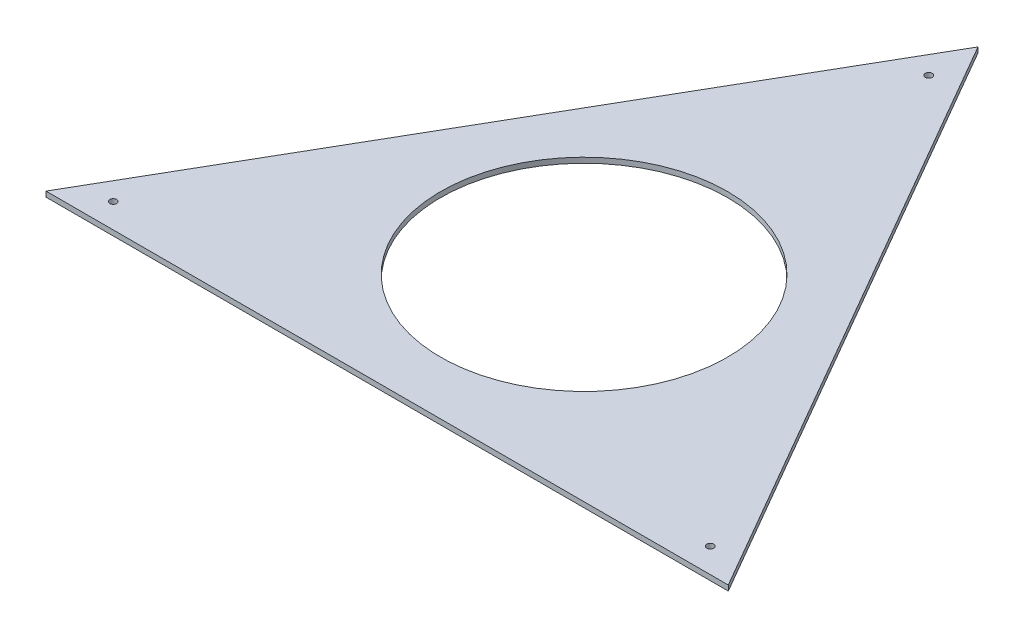
ISO-10303-21;
HEADER;
FILE_DESCRIPTION(('STEP AP214'),'2;1');
FILE_NAME('part.step','',(''),(''),'','','');
FILE_SCHEMA(('AUTOMOTIVE_DESIGN { 1 0 10303 214 1 1 1 1 }'));
ENDSEC;
DATA;
#1=APPLICATION_CONTEXT('core data for automotive mechanical design processes');
#2=APPLICATION_PROTOCOL_DEFINITION('international standard','automotive_design',2000,#1);
#3=PRODUCT_CONTEXT('',#1,'mechanical');
#4=PRODUCT('Part','Part','',(#3));
#5=PRODUCT_RELATED_PRODUCT_CATEGORY('part','',(#4));
#6=PRODUCT_DEFINITION_FORMATION('','',#4);
#7=PRODUCT_DEFINITION_CONTEXT('part definition',#1,'design');
#8=PRODUCT_DEFINITION('design','',#6,#7);
#9=PRODUCT_DEFINITION_SHAPE('','',#8);
#10=(LENGTH_UNIT() NAMED_UNIT(*) SI_UNIT(.MILLI.,.METRE.));
#11=(NAMED_UNIT(*) PLANE_ANGLE_UNIT() SI_UNIT($,.RADIAN.));
#12=(NAMED_UNIT(*) SI_UNIT($,.STERADIAN.) SOLID_ANGLE_UNIT());
#13=UNCERTAINTY_MEASURE_WITH_UNIT(LENGTH_MEASURE(1.E-05),#10,'distance_accuracy_value','');
#14=(GEOMETRIC_REPRESENTATION_CONTEXT(3) GLOBAL_UNCERTAINTY_ASSIGNED_CONTEXT((#13)) GLOBAL_UNIT_ASSIGNED_CONTEXT((#10,
#11,#12)) REPRESENTATION_CONTEXT('',''));
#15=CARTESIAN_POINT('',(0.,0.,0.));
#16=DIRECTION('',(0.,0.,1.));
#17=DIRECTION('',(1.,0.,0.));
#18=AXIS2_PLACEMENT_3D('',#15,#16,#17);
#19=CARTESIAN_POINT('',(307.958633585747,4.7625,177.8));
#20=DIRECTION('',(-0.866025403784438,0.,0.5));
#21=DIRECTION('',(0.5,0.,0.866025403784438));
#22=AXIS2_PLACEMENT_3D('',#19,#20,#21);
#23=PLANE('',#22);
#24=DIRECTION('',(-0.5,0.,-0.866025403784438));
#25=VECTOR('',#24,1.);
#26=CARTESIAN_POINT('',(307.958633585747,0.,177.8));
#27=LINE('',#26,#25);
#28=CARTESIAN_POINT('',(307.958633585747,0.,177.8));
#29=VERTEX_POINT('',#28);
#30=CARTESIAN_POINT('',(0.,0.,-355.6));
#31=VERTEX_POINT('',#30);
#32=EDGE_CURVE('E83',#29,#31,#27,.T.);
#33=ORIENTED_EDGE('',*,*,#32,.T.);
#34=DIRECTION('',(0.,-1.,0.));
#35=VECTOR('',#34,1.);
#36=CARTESIAN_POINT('',(0.,4.7625,-355.6));
#37=LINE('',#36,#35);
#38=CARTESIAN_POINT('',(0.,4.7625,-355.6));
#39=VERTEX_POINT('',#38);
#40=EDGE_CURVE('E11',#39,#31,#37,.T.);
#41=ORIENTED_EDGE('',*,*,#40,.F.);
#42=DIRECTION('',(-0.5,0.,-0.866025403784438));
#43=VECTOR('',#42,1.);
#44=CARTESIAN_POINT('',(307.958633585747,4.7625,177.8));
#45=LINE('',#44,#43);
#46=CARTESIAN_POINT('',(307.958633585747,4.7625,177.8));
#47=VERTEX_POINT('',#46);
#48=EDGE_CURVE('E76',#47,#39,#45,.T.);
#49=ORIENTED_EDGE('',*,*,#48,.F.);
#50=DIRECTION('',(0.,-1.,0.));
#51=VECTOR('',#50,1.);
#52=CARTESIAN_POINT('',(307.958633585747,4.7625,177.8));
#53=LINE('',#52,#51);
#54=EDGE_CURVE('E84',#47,#29,#53,.T.);
#55=ORIENTED_EDGE('',*,*,#54,.T.);
#56=EDGE_LOOP('',(#33,#41,#49,#55));
#57=FACE_BOUND('',#56,.T.);
#58=ADVANCED_FACE('F35',(#57),#23,.F.);
#59=CARTESIAN_POINT('',(0.,4.7625,-355.6));
#60=DIRECTION('',(0.866025403784439,0.,0.5));
#61=DIRECTION('',(0.5,0.,-0.866025403784439));
#62=AXIS2_PLACEMENT_3D('',#59,#60,#61);
#63=PLANE('',#62);
#64=DIRECTION('',(-0.5,0.,0.866025403784439));
#65=VECTOR('',#64,1.);
#66=CARTESIAN_POINT('',(0.,0.,-355.6));
#67=LINE('',#66,#65);
#68=CARTESIAN_POINT('',(-307.958633585746,0.,177.8));
#69=VERTEX_POINT('',#68);
#70=EDGE_CURVE('E64',#31,#69,#67,.T.);
#71=ORIENTED_EDGE('',*,*,#70,.T.);
#72=DIRECTION('',(0.,-1.,0.));
#73=VECTOR('',#72,1.);
#74=CARTESIAN_POINT('',(-307.958633585746,4.7625,177.8));
#75=LINE('',#74,#73);
#76=CARTESIAN_POINT('',(-307.958633585746,4.7625,177.8));
#77=VERTEX_POINT('',#76);
#78=EDGE_CURVE('E44',#77,#69,#75,.T.);
#79=ORIENTED_EDGE('',*,*,#78,.F.);
#80=DIRECTION('',(-0.5,0.,0.866025403784439));
#81=VECTOR('',#80,1.);
#82=CARTESIAN_POINT('',(0.,4.7625,-355.6));
#83=LINE('',#82,#81);
#84=EDGE_CURVE('E72',#39,#77,#83,.T.);
#85=ORIENTED_EDGE('',*,*,#84,.F.);
#86=ORIENTED_EDGE('',*,*,#40,.T.);
#87=EDGE_LOOP('',(#71,#79,#85,#86));
#88=FACE_BOUND('',#87,.T.);
#89=ADVANCED_FACE('F73',(#88),#63,.F.);
#90=CARTESIAN_POINT('',(-307.958633585746,4.7625,177.8));
#91=DIRECTION('',(0.,0.,-1.));
#92=DIRECTION('',(-1.,0.,0.));
#93=AXIS2_PLACEMENT_3D('',#90,#91,#92);
#94=PLANE('',#93);
#95=DIRECTION('',(1.,0.,0.));
#96=VECTOR('',#95,1.);
#97=CARTESIAN_POINT('',(-307.958633585746,0.,177.8));
#98=LINE('',#97,#96);
#99=EDGE_CURVE('E69',#69,#29,#98,.T.);
#100=ORIENTED_EDGE('',*,*,#99,.T.);
#101=ORIENTED_EDGE('',*,*,#54,.F.);
#102=DIRECTION('',(1.,0.,0.));
#103=VECTOR('',#102,1.);
#104=CARTESIAN_POINT('',(-307.958633585746,4.7625,177.8));
#105=LINE('',#104,#103);
#106=EDGE_CURVE('E52',#77,#47,#105,.T.);
#107=ORIENTED_EDGE('',*,*,#106,.F.);
#108=ORIENTED_EDGE('',*,*,#78,.T.);
#109=EDGE_LOOP('',(#100,#101,#107,#108));
#110=FACE_BOUND('',#109,.T.);
#111=ADVANCED_FACE('F94',(#110),#94,.F.);
#112=CARTESIAN_POINT('',(0.,4.7625,0.));
#113=DIRECTION('',(0.,1.,0.));
#114=DIRECTION('',(0.,0.,1.));
#115=AXIS2_PLACEMENT_3D('',#112,#113,#114);
#116=PLANE('',#115);
#117=CARTESIAN_POINT('',(269.463804387528,4.7625,155.575));
#118=DIRECTION('',(0.,-1.,0.));
#119=DIRECTION('',(0.,0.,1.));
#120=AXIS2_PLACEMENT_3D('',#117,#118,#119);
#121=CIRCLE('',#120,3.17499999999997);
#122=CARTESIAN_POINT('',(269.463804387528,4.7625,152.4));
#123=VERTEX_POINT('',#122);
#124=EDGE_CURVE('E188',#123,#123,#121,.T.);
#125=ORIENTED_EDGE('',*,*,#124,.T.);
#126=EDGE_LOOP('',(#125));
#127=FACE_BOUND('',#126,.T.);
#128=CARTESIAN_POINT('',(-269.463804387528,4.7625,155.575));
#129=DIRECTION('',(0.,1.,0.));
#130=DIRECTION('',(0.,0.,1.));
#131=AXIS2_PLACEMENT_3D('',#128,#129,#130);
#132=CIRCLE('',#131,3.17499999999997);
#133=CARTESIAN_POINT('',(-269.463804387528,4.7625,152.4));
#134=VERTEX_POINT('',#133);
#135=EDGE_CURVE('E198',#134,#134,#132,.T.);
#136=ORIENTED_EDGE('',*,*,#135,.F.);
#137=EDGE_LOOP('',(#136));
#138=FACE_BOUND('',#137,.T.);
#139=CARTESIAN_POINT('',(0.,4.7625,-311.15));
#140=DIRECTION('',(0.,1.,0.));
#141=DIRECTION('',(0.,0.,1.));
#142=AXIS2_PLACEMENT_3D('',#139,#140,#141);
#143=CIRCLE('',#142,3.175);
#144=CARTESIAN_POINT('',(0.,4.7625,-314.325));
#145=VERTEX_POINT('',#144);
#146=EDGE_CURVE('E183',#145,#145,#143,.T.);
#147=ORIENTED_EDGE('',*,*,#146,.F.);
#148=EDGE_LOOP('',(#147));
#149=FACE_BOUND('',#148,.T.);
#150=CARTESIAN_POINT('',(0.,4.7625,0.));
#151=DIRECTION('',(0.,1.,0.));
#152=DIRECTION('',(0.,0.,1.));
#153=AXIS2_PLACEMENT_3D('',#150,#151,#152);
#154=CIRCLE('',#153,129.54);
#155=CARTESIAN_POINT('',(0.,4.7625,-129.54));
#156=VERTEX_POINT('',#155);
#157=EDGE_CURVE('E89',#156,#156,#154,.T.);
#158=ORIENTED_EDGE('',*,*,#157,.F.);
#159=EDGE_LOOP('',(#158));
#160=FACE_BOUND('',#159,.T.);
#161=ORIENTED_EDGE('',*,*,#48,.T.);
#162=ORIENTED_EDGE('',*,*,#84,.T.);
#163=ORIENTED_EDGE('',*,*,#106,.T.);
#164=EDGE_LOOP('',(#161,#162,#163));
#165=FACE_BOUND('',#164,.T.);
#166=ADVANCED_FACE('F79',(#127,#138,#149,#160,#165),#116,.T.);
#167=CARTESIAN_POINT('',(0.,0.,0.));
#168=DIRECTION('',(0.,1.,0.));
#169=DIRECTION('',(0.,0.,1.));
#170=AXIS2_PLACEMENT_3D('',#167,#168,#169);
#171=PLANE('',#170);
#172=CARTESIAN_POINT('',(269.463804387528,0.,155.575));
#173=DIRECTION('',(0.,-1.,0.));
#174=DIRECTION('',(0.,0.,1.));
#175=AXIS2_PLACEMENT_3D('',#172,#173,#174);
#176=CIRCLE('',#175,3.17499999999997);
#177=CARTESIAN_POINT('',(269.463804387528,0.,152.4));
#178=VERTEX_POINT('',#177);
#179=EDGE_CURVE('E193',#178,#178,#176,.T.);
#180=ORIENTED_EDGE('',*,*,#179,.F.);
#181=EDGE_LOOP('',(#180));
#182=FACE_BOUND('',#181,.T.);
#183=CARTESIAN_POINT('',(-269.463804387528,0.,155.575));
#184=DIRECTION('',(0.,1.,0.));
#185=DIRECTION('',(0.,0.,1.));
#186=AXIS2_PLACEMENT_3D('',#183,#184,#185);
#187=CIRCLE('',#186,3.17499999999997);
#188=CARTESIAN_POINT('',(-269.463804387528,0.,152.4));
#189=VERTEX_POINT('',#188);
#190=EDGE_CURVE('E190',#189,#189,#187,.T.);
#191=ORIENTED_EDGE('',*,*,#190,.T.);
#192=EDGE_LOOP('',(#191));
#193=FACE_BOUND('',#192,.T.);
#194=CARTESIAN_POINT('',(0.,0.,-311.15));
#195=DIRECTION('',(0.,1.,0.));
#196=DIRECTION('',(0.,0.,1.));
#197=AXIS2_PLACEMENT_3D('',#194,#195,#196);
#198=CIRCLE('',#197,3.175);
#199=CARTESIAN_POINT('',(0.,0.,-314.325));
#200=VERTEX_POINT('',#199);
#201=EDGE_CURVE('E186',#200,#200,#198,.T.);
#202=ORIENTED_EDGE('',*,*,#201,.T.);
#203=EDGE_LOOP('',(#202));
#204=FACE_BOUND('',#203,.T.);
#205=CARTESIAN_POINT('',(0.,0.,0.));
#206=DIRECTION('',(0.,1.,0.));
#207=DIRECTION('',(0.,0.,1.));
#208=AXIS2_PLACEMENT_3D('',#205,#206,#207);
#209=CIRCLE('',#208,129.54);
#210=CARTESIAN_POINT('',(0.,0.,-129.54));
#211=VERTEX_POINT('',#210);
#212=EDGE_CURVE('E38',#211,#211,#209,.F.);
#213=ORIENTED_EDGE('',*,*,#212,.F.);
#214=EDGE_LOOP('',(#213));
#215=FACE_BOUND('',#214,.T.);
#216=ORIENTED_EDGE('',*,*,#32,.F.);
#217=ORIENTED_EDGE('',*,*,#99,.F.);
#218=ORIENTED_EDGE('',*,*,#70,.F.);
#219=EDGE_LOOP('',(#216,#217,#218));
#220=FACE_BOUND('',#219,.T.);
#221=ADVANCED_FACE('F95',(#182,#193,#204,#215,#220),#171,.F.);
#222=CARTESIAN_POINT('',(0.,4.7625,0.));
#223=DIRECTION('',(0.,-1.,0.));
#224=DIRECTION('',(0.,0.,-1.));
#225=AXIS2_PLACEMENT_3D('',#222,#223,#224);
#226=CYLINDRICAL_SURFACE('',#225,129.54);
#227=CARTESIAN_POINT('',(0.,4.7625,-129.54));
#228=CARTESIAN_POINT('',(0.,4.712890625,-129.54));
#229=CARTESIAN_POINT('',(0.,4.66328125,-129.54));
#230=CARTESIAN_POINT('',(0.,4.5640625,-129.54));
#231=CARTESIAN_POINT('',(0.,4.514453125,-129.54));
#232=CARTESIAN_POINT('',(0.,4.415234375,-129.54));
#233=CARTESIAN_POINT('',(0.,4.365625,-129.54));
#234=CARTESIAN_POINT('',(0.,4.26640625,-129.54));
#235=CARTESIAN_POINT('',(0.,4.216796875,-129.54));
#236=CARTESIAN_POINT('',(0.,4.117578125,-129.54));
#237=CARTESIAN_POINT('',(0.,4.06796875,-129.54));
#238=CARTESIAN_POINT('',(0.,3.96875,-129.54));
#239=CARTESIAN_POINT('',(0.,3.919140625,-129.54));
#240=CARTESIAN_POINT('',(0.,3.819921875,-129.54));
#241=CARTESIAN_POINT('',(0.,3.7703125,-129.54));
#242=CARTESIAN_POINT('',(0.,3.67109375,-129.54));
#243=CARTESIAN_POINT('',(0.,3.621484375,-129.54));
#244=CARTESIAN_POINT('',(0.,3.522265625,-129.54));
#245=CARTESIAN_POINT('',(0.,3.47265625,-129.54));
#246=CARTESIAN_POINT('',(0.,3.3734375,-129.54));
#247=CARTESIAN_POINT('',(0.,3.323828125,-129.54));
#248=CARTESIAN_POINT('',(0.,3.224609375,-129.54));
#249=CARTESIAN_POINT('',(0.,3.175,-129.54));
#250=CARTESIAN_POINT('',(0.,3.07578125,-129.54));
#251=CARTESIAN_POINT('',(0.,3.026171875,-129.54));
#252=CARTESIAN_POINT('',(0.,2.926953125,-129.54));
#253=CARTESIAN_POINT('',(0.,2.87734375,-129.54));
#254=CARTESIAN_POINT('',(0.,2.778125,-129.54));
#255=CARTESIAN_POINT('',(0.,2.728515625,-129.54));
#256=CARTESIAN_POINT('',(0.,2.629296875,-129.54));
#257=CARTESIAN_POINT('',(0.,2.5796875,-129.54));
#258=CARTESIAN_POINT('',(0.,2.48046875,-129.54));
#259=CARTESIAN_POINT('',(0.,2.430859375,-129.54));
#260=CARTESIAN_POINT('',(0.,2.331640625,-129.54));
#261=CARTESIAN_POINT('',(0.,2.28203125,-129.54));
#262=CARTESIAN_POINT('',(0.,2.1828125,-129.54));
#263=CARTESIAN_POINT('',(0.,2.133203125,-129.54));
#264=CARTESIAN_POINT('',(0.,2.033984375,-129.54));
#265=CARTESIAN_POINT('',(0.,1.984375,-129.54));
#266=CARTESIAN_POINT('',(0.,1.88515625,-129.54));
#267=CARTESIAN_POINT('',(0.,1.835546875,-129.54));
#268=CARTESIAN_POINT('',(0.,1.736328125,-129.54));
#269=CARTESIAN_POINT('',(0.,1.68671875,-129.54));
#270=CARTESIAN_POINT('',(0.,1.5875,-129.54));
#271=CARTESIAN_POINT('',(0.,1.537890625,-129.54));
#272=CARTESIAN_POINT('',(0.,1.438671875,-129.54));
#273=CARTESIAN_POINT('',(0.,1.3890625,-129.54));
#274=CARTESIAN_POINT('',(0.,1.28984375,-129.54));
#275=CARTESIAN_POINT('',(0.,1.240234375,-129.54));
#276=CARTESIAN_POINT('',(0.,1.141015625,-129.54));
#277=CARTESIAN_POINT('',(0.,1.09140625,-129.54));
#278=CARTESIAN_POINT('',(0.,0.992187499999999,-129.54));
#279=CARTESIAN_POINT('',(0.,0.942578124999999,-129.54));
#280=CARTESIAN_POINT('',(0.,0.843359375,-129.54));
#281=CARTESIAN_POINT('',(0.,0.79375,-129.54));
#282=CARTESIAN_POINT('',(0.,0.69453125,-129.54));
#283=CARTESIAN_POINT('',(0.,0.644921875,-129.54));
#284=CARTESIAN_POINT('',(0.,0.545703125,-129.54));
#285=CARTESIAN_POINT('',(0.,0.49609375,-129.54));
#286=CARTESIAN_POINT('',(0.,0.396875,-129.54));
#287=CARTESIAN_POINT('',(0.,0.347265625,-129.54));
#288=CARTESIAN_POINT('',(0.,0.248046875,-129.54));
#289=CARTESIAN_POINT('',(0.,0.1984375,-129.54));
#290=CARTESIAN_POINT('',(0.,0.09921875,-129.54));
#291=CARTESIAN_POINT('',(0.,0.049609375,-129.54));
#292=CARTESIAN_POINT('',(0.,0.,-129.54));
#293=B_SPLINE_CURVE_WITH_KNOTS('',3,(#227,#228,#229,#230,#231,#232,#233,#234,#235,#236,#237,
#238,#239,#240,#241,#242,#243,#244,#245,#246,#247,#248,#249,#250,#251,#252,#253,#254,#255,#256,
#257,#258,#259,#260,#261,#262,#263,#264,#265,#266,#267,#268,#269,#270,#271,#272,#273,#274,#275,
#276,#277,#278,#279,#280,#281,#282,#283,#284,#285,#286,#287,#288,#289,#290,#291,#292),
.UNSPECIFIED.,.F.,.F.,(4,2,2,2,2,2,2,2,2,2,2,2,2,2,2,2,2,2,2,2,2,2,2,2,2,2,2,2,2,2,2,2,4),(0.,
0.148828125,0.29765625,0.446484375,0.5953125,0.744140625,0.892968750000001,1.041796875,1.190625,
1.339453125,1.48828125,1.637109375,1.7859375,1.934765625,2.08359375,2.232421875,2.38125,
2.530078125,2.67890625,2.827734375,2.9765625,3.125390625,3.27421875,3.423046875,3.571875,
3.720703125,3.86953125,4.018359375,4.1671875,4.316015625,4.46484375,4.613671875,4.7625),.UNSPECIFIED.);
#294=EDGE_CURVE('BSEAM97',#156,#211,#293,.T.);
#295=ORIENTED_EDGE('',*,*,#157,.T.);
#296=ORIENTED_EDGE('',*,*,#212,.T.);
#297=ORIENTED_EDGE('',*,*,#294,.T.);
#298=ORIENTED_EDGE('',*,*,#294,.F.);
#299=EDGE_LOOP('',(#295,#297,#296,#298));
#300=FACE_BOUND('',#299,.T.);
#301=ADVANCED_FACE('F97',(#300),#226,.F.);
#302=CARTESIAN_POINT('',(0.,4.7625,-311.15));
#303=DIRECTION('',(0.,-1.,0.));
#304=DIRECTION('',(0.,0.,-1.));
#305=AXIS2_PLACEMENT_3D('',#302,#303,#304);
#306=CYLINDRICAL_SURFACE('',#305,3.175);
#307=CARTESIAN_POINT('',(0.,4.7625,-314.325));
#308=CARTESIAN_POINT('',(0.,4.712890625,-314.325));
#309=CARTESIAN_POINT('',(0.,4.66328125,-314.325));
#310=CARTESIAN_POINT('',(0.,4.5640625,-314.325));
#311=CARTESIAN_POINT('',(0.,4.514453125,-314.325));
#312=CARTESIAN_POINT('',(0.,4.415234375,-314.325));
#313=CARTESIAN_POINT('',(0.,4.365625,-314.325));
#314=CARTESIAN_POINT('',(0.,4.26640625,-314.325));
#315=CARTESIAN_POINT('',(0.,4.216796875,-314.325));
#316=CARTESIAN_POINT('',(0.,4.117578125,-314.325));
#317=CARTESIAN_POINT('',(0.,4.06796875,-314.325));
#318=CARTESIAN_POINT('',(0.,3.96875,-314.325));
#319=CARTESIAN_POINT('',(0.,3.919140625,-314.325));
#320=CARTESIAN_POINT('',(0.,3.819921875,-314.325));
#321=CARTESIAN_POINT('',(0.,3.7703125,-314.325));
#322=CARTESIAN_POINT('',(0.,3.67109375,-314.325));
#323=CARTESIAN_POINT('',(0.,3.621484375,-314.325));
#324=CARTESIAN_POINT('',(0.,3.522265625,-314.325));
#325=CARTESIAN_POINT('',(0.,3.47265625,-314.325));
#326=CARTESIAN_POINT('',(0.,3.3734375,-314.325));
#327=CARTESIAN_POINT('',(0.,3.323828125,-314.325));
#328=CARTESIAN_POINT('',(0.,3.224609375,-314.325));
#329=CARTESIAN_POINT('',(0.,3.175,-314.325));
#330=CARTESIAN_POINT('',(0.,3.07578125,-314.325));
#331=CARTESIAN_POINT('',(0.,3.026171875,-314.325));
#332=CARTESIAN_POINT('',(0.,2.926953125,-314.325));
#333=CARTESIAN_POINT('',(0.,2.87734375,-314.325));
#334=CARTESIAN_POINT('',(0.,2.778125,-314.325));
#335=CARTESIAN_POINT('',(0.,2.728515625,-314.325));
#336=CARTESIAN_POINT('',(0.,2.629296875,-314.325));
#337=CARTESIAN_POINT('',(0.,2.5796875,-314.325));
#338=CARTESIAN_POINT('',(0.,2.48046875,-314.325));
#339=CARTESIAN_POINT('',(0.,2.430859375,-314.325));
#340=CARTESIAN_POINT('',(0.,2.331640625,-314.325));
#341=CARTESIAN_POINT('',(0.,2.28203125,-314.325));
#342=CARTESIAN_POINT('',(0.,2.1828125,-314.325));
#343=CARTESIAN_POINT('',(0.,2.133203125,-314.325));
#344=CARTESIAN_POINT('',(0.,2.033984375,-314.325));
#345=CARTESIAN_POINT('',(0.,1.984375,-314.325));
#346=CARTESIAN_POINT('',(0.,1.88515625,-314.325));
#347=CARTESIAN_POINT('',(0.,1.835546875,-314.325));
#348=CARTESIAN_POINT('',(0.,1.736328125,-314.325));
#349=CARTESIAN_POINT('',(0.,1.68671875,-314.325));
#350=CARTESIAN_POINT('',(0.,1.5875,-314.325));
#351=CARTESIAN_POINT('',(0.,1.537890625,-314.325));
#352=CARTESIAN_POINT('',(0.,1.438671875,-314.325));
#353=CARTESIAN_POINT('',(0.,1.3890625,-314.325));
#354=CARTESIAN_POINT('',(0.,1.28984375,-314.325));
#355=CARTESIAN_POINT('',(0.,1.240234375,-314.325));
#356=CARTESIAN_POINT('',(0.,1.141015625,-314.325));
#357=CARTESIAN_POINT('',(0.,1.09140625,-314.325));
#358=CARTESIAN_POINT('',(0.,0.9921875,-314.325));
#359=CARTESIAN_POINT('',(0.,0.942578125,-314.325));
#360=CARTESIAN_POINT('',(0.,0.843359375,-314.325));
#361=CARTESIAN_POINT('',(0.,0.79375,-314.325));
#362=CARTESIAN_POINT('',(0.,0.69453125,-314.325));
#363=CARTESIAN_POINT('',(0.,0.644921875,-314.325));
#364=CARTESIAN_POINT('',(0.,0.545703125,-314.325));
#365=CARTESIAN_POINT('',(0.,0.49609375,-314.325));
#366=CARTESIAN_POINT('',(0.,0.396875,-314.325));
#367=CARTESIAN_POINT('',(0.,0.347265625,-314.325));
#368=CARTESIAN_POINT('',(0.,0.248046875,-314.325));
#369=CARTESIAN_POINT('',(0.,0.1984375,-314.325));
#370=CARTESIAN_POINT('',(0.,0.09921875,-314.325));
#371=CARTESIAN_POINT('',(0.,0.049609375,-314.325));
#372=CARTESIAN_POINT('',(0.,0.,-314.325));
#373=B_SPLINE_CURVE_WITH_KNOTS('',3,(#307,#308,#309,#310,#311,#312,#313,#314,#315,#316,#317,
#318,#319,#320,#321,#322,#323,#324,#325,#326,#327,#328,#329,#330,#331,#332,#333,#334,#335,#336,
#337,#338,#339,#340,#341,#342,#343,#344,#345,#346,#347,#348,#349,#350,#351,#352,#353,#354,#355,
#356,#357,#358,#359,#360,#361,#362,#363,#364,#365,#366,#367,#368,#369,#370,#371,#372),
.UNSPECIFIED.,.F.,.F.,(4,2,2,2,2,2,2,2,2,2,2,2,2,2,2,2,2,2,2,2,2,2,2,2,2,2,2,2,2,2,2,2,4),(0.,
0.148828124999999,0.297656249999999,0.446484374999999,0.595312499999999,0.744140625,0.89296875,
1.041796875,1.190625,1.339453125,1.48828125,1.637109375,1.7859375,1.934765625,2.08359375,
2.232421875,2.38125,2.530078125,2.67890625,2.827734375,2.9765625,3.125390625,3.27421875,
3.423046875,3.571875,3.720703125,3.86953125,4.018359375,4.1671875,4.316015625,4.46484375,
4.613671875,4.7625),.UNSPECIFIED.);
#374=EDGE_CURVE('BSEAM104',#145,#200,#373,.T.);
#375=ORIENTED_EDGE('',*,*,#146,.T.);
#376=ORIENTED_EDGE('',*,*,#201,.F.);
#377=ORIENTED_EDGE('',*,*,#374,.T.);
#378=ORIENTED_EDGE('',*,*,#374,.F.);
#379=EDGE_LOOP('',(#375,#377,#376,#378));
#380=FACE_BOUND('',#379,.T.);
#381=ADVANCED_FACE('F104',(#380),#306,.F.);
#382=CARTESIAN_POINT('',(-269.463804387528,4.7625,155.575));
#383=DIRECTION('',(0.,-1.,0.));
#384=DIRECTION('',(0.,0.,-1.));
#385=AXIS2_PLACEMENT_3D('',#382,#383,#384);
#386=CYLINDRICAL_SURFACE('',#385,3.17499999999997);
#387=CARTESIAN_POINT('',(-269.463804387528,4.7625,152.4));
#388=CARTESIAN_POINT('',(-269.463804387528,4.712890625,152.4));
#389=CARTESIAN_POINT('',(-269.463804387528,4.66328125,152.4));
#390=CARTESIAN_POINT('',(-269.463804387528,4.5640625,152.4));
#391=CARTESIAN_POINT('',(-269.463804387528,4.514453125,152.4));
#392=CARTESIAN_POINT('',(-269.463804387528,4.415234375,152.4));
#393=CARTESIAN_POINT('',(-269.463804387528,4.365625,152.4));
#394=CARTESIAN_POINT('',(-269.463804387528,4.26640625,152.4));
#395=CARTESIAN_POINT('',(-269.463804387528,4.216796875,152.4));
#396=CARTESIAN_POINT('',(-269.463804387528,4.117578125,152.4));
#397=CARTESIAN_POINT('',(-269.463804387528,4.06796875,152.4));
#398=CARTESIAN_POINT('',(-269.463804387528,3.96875,152.4));
#399=CARTESIAN_POINT('',(-269.463804387528,3.919140625,152.4));
#400=CARTESIAN_POINT('',(-269.463804387528,3.819921875,152.4));
#401=CARTESIAN_POINT('',(-269.463804387528,3.7703125,152.4));
#402=CARTESIAN_POINT('',(-269.463804387528,3.67109375,152.4));
#403=CARTESIAN_POINT('',(-269.463804387528,3.621484375,152.4));
#404=CARTESIAN_POINT('',(-269.463804387528,3.522265625,152.4));
#405=CARTESIAN_POINT('',(-269.463804387528,3.47265625,152.4));
#406=CARTESIAN_POINT('',(-269.463804387528,3.3734375,152.4));
#407=CARTESIAN_POINT('',(-269.463804387528,3.323828125,152.4));
#408=CARTESIAN_POINT('',(-269.463804387528,3.224609375,152.4));
#409=CARTESIAN_POINT('',(-269.463804387528,3.175,152.4));
#410=CARTESIAN_POINT('',(-269.463804387528,3.07578125,152.4));
#411=CARTESIAN_POINT('',(-269.463804387528,3.026171875,152.4));
#412=CARTESIAN_POINT('',(-269.463804387528,2.926953125,152.4));
#413=CARTESIAN_POINT('',(-269.463804387528,2.87734375,152.4));
#414=CARTESIAN_POINT('',(-269.463804387528,2.778125,152.4));
#415=CARTESIAN_POINT('',(-269.463804387528,2.728515625,152.4));
#416=CARTESIAN_POINT('',(-269.463804387528,2.629296875,152.4));
#417=CARTESIAN_POINT('',(-269.463804387528,2.5796875,152.4));
#418=CARTESIAN_POINT('',(-269.463804387528,2.48046875,152.4));
#419=CARTESIAN_POINT('',(-269.463804387528,2.430859375,152.4));
#420=CARTESIAN_POINT('',(-269.463804387528,2.331640625,152.4));
#421=CARTESIAN_POINT('',(-269.463804387528,2.28203125,152.4));
#422=CARTESIAN_POINT('',(-269.463804387528,2.1828125,152.4));
#423=CARTESIAN_POINT('',(-269.463804387528,2.133203125,152.4));
#424=CARTESIAN_POINT('',(-269.463804387528,2.033984375,152.4));
#425=CARTESIAN_POINT('',(-269.463804387528,1.984375,152.4));
#426=CARTESIAN_POINT('',(-269.463804387528,1.88515625,152.4));
#427=CARTESIAN_POINT('',(-269.463804387528,1.835546875,152.4));
#428=CARTESIAN_POINT('',(-269.463804387528,1.736328125,152.4));
#429=CARTESIAN_POINT('',(-269.463804387528,1.68671875,152.4));
#430=CARTESIAN_POINT('',(-269.463804387528,1.5875,152.4));
#431=CARTESIAN_POINT('',(-269.463804387528,1.537890625,152.4));
#432=CARTESIAN_POINT('',(-269.463804387528,1.438671875,152.4));
#433=CARTESIAN_POINT('',(-269.463804387528,1.3890625,152.4));
#434=CARTESIAN_POINT('',(-269.463804387528,1.28984375,152.4));
#435=CARTESIAN_POINT('',(-269.463804387528,1.240234375,152.4));
#436=CARTESIAN_POINT('',(-269.463804387528,1.141015625,152.4));
#437=CARTESIAN_POINT('',(-269.463804387528,1.09140625,152.4));
#438=CARTESIAN_POINT('',(-269.463804387528,0.9921875,152.4));
#439=CARTESIAN_POINT('',(-269.463804387528,0.942578125,152.4));
#440=CARTESIAN_POINT('',(-269.463804387528,0.843359375,152.4));
#441=CARTESIAN_POINT('',(-269.463804387528,0.79375,152.4));
#442=CARTESIAN_POINT('',(-269.463804387528,0.69453125,152.4));
#443=CARTESIAN_POINT('',(-269.463804387528,0.644921875,152.4));
#444=CARTESIAN_POINT('',(-269.463804387528,0.545703125,152.4));
#445=CARTESIAN_POINT('',(-269.463804387528,0.49609375,152.4));
#446=CARTESIAN_POINT('',(-269.463804387528,0.396875,152.4));
#447=CARTESIAN_POINT('',(-269.463804387528,0.347265625,152.4));
#448=CARTESIAN_POINT('',(-269.463804387528,0.248046875,152.4));
#449=CARTESIAN_POINT('',(-269.463804387528,0.1984375,152.4));
#450=CARTESIAN_POINT('',(-269.463804387528,0.09921875,152.4));
#451=CARTESIAN_POINT('',(-269.463804387528,0.049609375,152.4));
#452=CARTESIAN_POINT('',(-269.463804387528,0.,152.4));
#453=B_SPLINE_CURVE_WITH_KNOTS('',3,(#387,#388,#389,#390,#391,#392,#393,#394,#395,#396,#397,
#398,#399,#400,#401,#402,#403,#404,#405,#406,#407,#408,#409,#410,#411,#412,#413,#414,#415,#416,
#417,#418,#419,#420,#421,#422,#423,#424,#425,#426,#427,#428,#429,#430,#431,#432,#433,#434,#435,
#436,#437,#438,#439,#440,#441,#442,#443,#444,#445,#446,#447,#448,#449,#450,#451,#452),
.UNSPECIFIED.,.F.,.F.,(4,2,2,2,2,2,2,2,2,2,2,2,2,2,2,2,2,2,2,2,2,2,2,2,2,2,2,2,2,2,2,2,4),(0.,
0.148828124999999,0.297656249999999,0.446484374999999,0.595312499999999,0.744140625,0.89296875,
1.041796875,1.190625,1.339453125,1.48828125,1.637109375,1.7859375,1.934765625,2.08359375,
2.232421875,2.38125,2.530078125,2.67890625,2.827734375,2.9765625,3.125390625,3.27421875,
3.423046875,3.571875,3.720703125,3.86953125,4.018359375,4.1671875,4.316015625,4.46484375,
4.613671875,4.7625),.UNSPECIFIED.);
#454=EDGE_CURVE('BSEAM144',#134,#189,#453,.T.);
#455=ORIENTED_EDGE('',*,*,#135,.T.);
#456=ORIENTED_EDGE('',*,*,#190,.F.);
#457=ORIENTED_EDGE('',*,*,#454,.T.);
#458=ORIENTED_EDGE('',*,*,#454,.F.);
#459=EDGE_LOOP('',(#455,#457,#456,#458));
#460=FACE_BOUND('',#459,.T.);
#461=ADVANCED_FACE('F144',(#460),#386,.F.);
#462=CARTESIAN_POINT('',(269.463804387528,4.7625,155.575));
#463=DIRECTION('',(0.,-1.,0.));
#464=DIRECTION('',(0.,0.,-1.));
#465=AXIS2_PLACEMENT_3D('',#462,#463,#464);
#466=CYLINDRICAL_SURFACE('',#465,3.17499999999997);
#467=CARTESIAN_POINT('',(269.463804387528,4.7625,152.4));
#468=CARTESIAN_POINT('',(269.463804387528,4.712890625,152.4));
#469=CARTESIAN_POINT('',(269.463804387528,4.66328125,152.4));
#470=CARTESIAN_POINT('',(269.463804387528,4.5640625,152.4));
#471=CARTESIAN_POINT('',(269.463804387528,4.514453125,152.4));
#472=CARTESIAN_POINT('',(269.463804387528,4.415234375,152.4));
#473=CARTESIAN_POINT('',(269.463804387528,4.365625,152.4));
#474=CARTESIAN_POINT('',(269.463804387528,4.26640625,152.4));
#475=CARTESIAN_POINT('',(269.463804387528,4.216796875,152.4));
#476=CARTESIAN_POINT('',(269.463804387528,4.117578125,152.4));
#477=CARTESIAN_POINT('',(269.463804387528,4.06796875,152.4));
#478=CARTESIAN_POINT('',(269.463804387528,3.96875,152.4));
#479=CARTESIAN_POINT('',(269.463804387528,3.919140625,152.4));
#480=CARTESIAN_POINT('',(269.463804387528,3.819921875,152.4));
#481=CARTESIAN_POINT('',(269.463804387528,3.7703125,152.4));
#482=CARTESIAN_POINT('',(269.463804387528,3.67109375,152.4));
#483=CARTESIAN_POINT('',(269.463804387528,3.621484375,152.4));
#484=CARTESIAN_POINT('',(269.463804387528,3.522265625,152.4));
#485=CARTESIAN_POINT('',(269.463804387528,3.47265625,152.4));
#486=CARTESIAN_POINT('',(269.463804387528,3.3734375,152.4));
#487=CARTESIAN_POINT('',(269.463804387528,3.323828125,152.4));
#488=CARTESIAN_POINT('',(269.463804387528,3.224609375,152.4));
#489=CARTESIAN_POINT('',(269.463804387528,3.175,152.4));
#490=CARTESIAN_POINT('',(269.463804387528,3.07578125,152.4));
#491=CARTESIAN_POINT('',(269.463804387528,3.026171875,152.4));
#492=CARTESIAN_POINT('',(269.463804387528,2.926953125,152.4));
#493=CARTESIAN_POINT('',(269.463804387528,2.87734375,152.4));
#494=CARTESIAN_POINT('',(269.463804387528,2.778125,152.4));
#495=CARTESIAN_POINT('',(269.463804387528,2.728515625,152.4));
#496=CARTESIAN_POINT('',(269.463804387528,2.629296875,152.4));
#497=CARTESIAN_POINT('',(269.463804387528,2.5796875,152.4));
#498=CARTESIAN_POINT('',(269.463804387528,2.48046875,152.4));
#499=CARTESIAN_POINT('',(269.463804387528,2.430859375,152.4));
#500=CARTESIAN_POINT('',(269.463804387528,2.331640625,152.4));
#501=CARTESIAN_POINT('',(269.463804387528,2.28203125,152.4));
#502=CARTESIAN_POINT('',(269.463804387528,2.1828125,152.4));
#503=CARTESIAN_POINT('',(269.463804387528,2.133203125,152.4));
#504=CARTESIAN_POINT('',(269.463804387528,2.033984375,152.4));
#505=CARTESIAN_POINT('',(269.463804387528,1.984375,152.4));
#506=CARTESIAN_POINT('',(269.463804387528,1.88515625,152.4));
#507=CARTESIAN_POINT('',(269.463804387528,1.835546875,152.4));
#508=CARTESIAN_POINT('',(269.463804387528,1.736328125,152.4));
#509=CARTESIAN_POINT('',(269.463804387528,1.68671875,152.4));
#510=CARTESIAN_POINT('',(269.463804387528,1.5875,152.4));
#511=CARTESIAN_POINT('',(269.463804387528,1.537890625,152.4));
#512=CARTESIAN_POINT('',(269.463804387528,1.438671875,152.4));
#513=CARTESIAN_POINT('',(269.463804387528,1.3890625,152.4));
#514=CARTESIAN_POINT('',(269.463804387528,1.28984375,152.4));
#515=CARTESIAN_POINT('',(269.463804387528,1.240234375,152.4));
#516=CARTESIAN_POINT('',(269.463804387528,1.141015625,152.4));
#517=CARTESIAN_POINT('',(269.463804387528,1.09140625,152.4));
#518=CARTESIAN_POINT('',(269.463804387528,0.9921875,152.4));
#519=CARTESIAN_POINT('',(269.463804387528,0.942578125,152.4));
#520=CARTESIAN_POINT('',(269.463804387528,0.843359375,152.4));
#521=CARTESIAN_POINT('',(269.463804387528,0.79375,152.4));
#522=CARTESIAN_POINT('',(269.463804387528,0.69453125,152.4));
#523=CARTESIAN_POINT('',(269.463804387528,0.644921875,152.4));
#524=CARTESIAN_POINT('',(269.463804387528,0.545703125,152.4));
#525=CARTESIAN_POINT('',(269.463804387528,0.49609375,152.4));
#526=CARTESIAN_POINT('',(269.463804387528,0.396875,152.4));
#527=CARTESIAN_POINT('',(269.463804387528,0.347265625,152.4));
#528=CARTESIAN_POINT('',(269.463804387528,0.248046875,152.4));
#529=CARTESIAN_POINT('',(269.463804387528,0.1984375,152.4));
#530=CARTESIAN_POINT('',(269.463804387528,0.09921875,152.4));
#531=CARTESIAN_POINT('',(269.463804387528,0.049609375,152.4));
#532=CARTESIAN_POINT('',(269.463804387528,0.,152.4));
#533=B_SPLINE_CURVE_WITH_KNOTS('',3,(#467,#468,#469,#470,#471,#472,#473,#474,#475,#476,#477,
#478,#479,#480,#481,#482,#483,#484,#485,#486,#487,#488,#489,#490,#491,#492,#493,#494,#495,#496,
#497,#498,#499,#500,#501,#502,#503,#504,#505,#506,#507,#508,#509,#510,#511,#512,#513,#514,#515,
#516,#517,#518,#519,#520,#521,#522,#523,#524,#525,#526,#527,#528,#529,#530,#531,#532),
.UNSPECIFIED.,.F.,.F.,(4,2,2,2,2,2,2,2,2,2,2,2,2,2,2,2,2,2,2,2,2,2,2,2,2,2,2,2,2,2,2,2,4),(0.,
0.148828125,0.29765625,0.446484375,0.5953125,0.744140625,0.892968750000001,1.041796875,1.190625,
1.339453125,1.48828125,1.637109375,1.7859375,1.934765625,2.08359375,2.232421875,2.38125,
2.530078125,2.67890625,2.827734375,2.9765625,3.125390625,3.27421875,3.423046875,3.571875,
3.720703125,3.86953125,4.018359375,4.1671875,4.316015625,4.46484375,4.613671875,4.7625),.UNSPECIFIED.);
#534=EDGE_CURVE('BSEAM154',#123,#178,#533,.T.);
#535=ORIENTED_EDGE('',*,*,#124,.F.);
#536=ORIENTED_EDGE('',*,*,#179,.T.);
#537=ORIENTED_EDGE('',*,*,#534,.T.);
#538=ORIENTED_EDGE('',*,*,#534,.F.);
#539=EDGE_LOOP('',(#535,#537,#536,#538));
#540=FACE_BOUND('',#539,.T.);
#541=ADVANCED_FACE('F154',(#540),#466,.F.);
#542=CLOSED_SHELL('',(#58,#89,#111,#166,#221,#301,#381,#461,#541));
#543=MANIFOLD_SOLID_BREP('B2',#542);
#544=ADVANCED_BREP_SHAPE_REPRESENTATION('',(#18,#543),#14);
#545=SHAPE_DEFINITION_REPRESENTATION(#9,#544);
ENDSEC;
END-ISO-10303-21;
